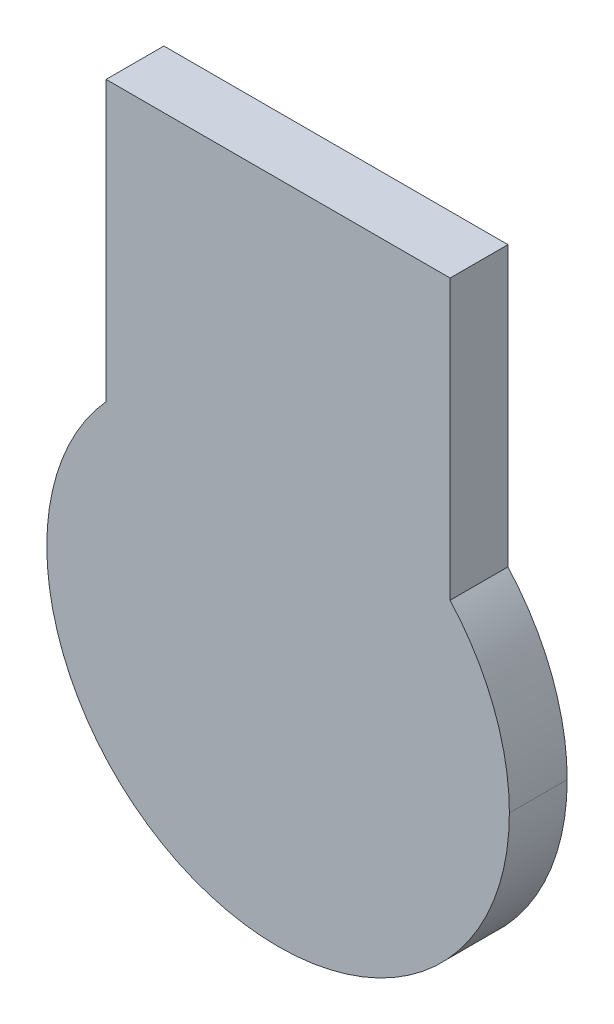
ISO-10303-21;
HEADER;
FILE_DESCRIPTION(('STEP AP214'),'2;1');
FILE_NAME('part.step','',(''),(''),'','','');
FILE_SCHEMA(('AUTOMOTIVE_DESIGN { 1 0 10303 214 1 1 1 1 }'));
ENDSEC;
DATA;
#1=APPLICATION_CONTEXT('core data for automotive mechanical design processes');
#2=APPLICATION_PROTOCOL_DEFINITION('international standard','automotive_design',2000,#1);
#3=PRODUCT_CONTEXT('',#1,'mechanical');
#4=PRODUCT('Part','Part','',(#3));
#5=PRODUCT_RELATED_PRODUCT_CATEGORY('part','',(#4));
#6=PRODUCT_DEFINITION_FORMATION('','',#4);
#7=PRODUCT_DEFINITION_CONTEXT('part definition',#1,'design');
#8=PRODUCT_DEFINITION('design','',#6,#7);
#9=PRODUCT_DEFINITION_SHAPE('','',#8);
#10=(LENGTH_UNIT() NAMED_UNIT(*) SI_UNIT(.MILLI.,.METRE.));
#11=(NAMED_UNIT(*) PLANE_ANGLE_UNIT() SI_UNIT($,.RADIAN.));
#12=(NAMED_UNIT(*) SI_UNIT($,.STERADIAN.) SOLID_ANGLE_UNIT());
#13=UNCERTAINTY_MEASURE_WITH_UNIT(LENGTH_MEASURE(1.E-05),#10,'distance_accuracy_value','');
#14=(GEOMETRIC_REPRESENTATION_CONTEXT(3) GLOBAL_UNCERTAINTY_ASSIGNED_CONTEXT((#13)) GLOBAL_UNIT_ASSIGNED_CONTEXT((#10,
#11,#12)) REPRESENTATION_CONTEXT('',''));
#15=CARTESIAN_POINT('',(0.,0.,0.));
#16=DIRECTION('',(0.,0.,1.));
#17=DIRECTION('',(1.,0.,0.));
#18=AXIS2_PLACEMENT_3D('',#15,#16,#17);
#19=CARTESIAN_POINT('',(0.,0.,0.));
#20=DIRECTION('',(0.,0.,1.));
#21=DIRECTION('',(1.,0.,0.));
#22=AXIS2_PLACEMENT_3D('',#19,#20,#21);
#23=CYLINDRICAL_SURFACE('',#22,0.8);
#24=CARTESIAN_POINT('',(0.,0.,0.));
#25=DIRECTION('',(0.,0.,1.));
#26=DIRECTION('',(1.,0.,0.));
#27=AXIS2_PLACEMENT_3D('',#24,#25,#26);
#28=CIRCLE('',#27,0.8);
#29=CARTESIAN_POINT('',(-0.595,0.534766304099277,0.));
#30=VERTEX_POINT('',#29);
#31=CARTESIAN_POINT('',(-0.8,0.,0.));
#32=VERTEX_POINT('',#31);
#33=EDGE_CURVE('E11',#30,#32,#28,.T.);
#34=ORIENTED_EDGE('',*,*,#33,.T.);
#35=DIRECTION('',(0.,0.,1.));
#36=VECTOR('',#35,1.);
#37=CARTESIAN_POINT('',(-0.8,0.,0.));
#38=LINE('',#37,#36);
#39=CARTESIAN_POINT('',(-0.8,0.,0.2));
#40=VERTEX_POINT('',#39);
#41=EDGE_CURVE('E23',#32,#40,#38,.T.);
#42=ORIENTED_EDGE('',*,*,#41,.T.);
#43=CARTESIAN_POINT('',(0.,0.,0.2));
#44=DIRECTION('',(0.,0.,1.));
#45=DIRECTION('',(1.,0.,0.));
#46=AXIS2_PLACEMENT_3D('',#43,#44,#45);
#47=CIRCLE('',#46,0.8);
#48=CARTESIAN_POINT('',(-0.595,0.534766304099277,0.2));
#49=VERTEX_POINT('',#48);
#50=EDGE_CURVE('E113',#49,#40,#47,.T.);
#51=ORIENTED_EDGE('',*,*,#50,.F.);
#52=DIRECTION('',(0.,0.,1.));
#53=VECTOR('',#52,1.);
#54=CARTESIAN_POINT('',(-0.595,0.534766304099277,0.));
#55=LINE('',#54,#53);
#56=EDGE_CURVE('E87',#30,#49,#55,.T.);
#57=ORIENTED_EDGE('',*,*,#56,.F.);
#58=EDGE_LOOP('',(#34,#42,#51,#57));
#59=FACE_BOUND('',#58,.T.);
#60=ADVANCED_FACE('F16',(#59),#23,.T.);
#61=CARTESIAN_POINT('',(0.,0.,0.));
#62=DIRECTION('',(0.,0.,1.));
#63=DIRECTION('',(1.,0.,0.));
#64=AXIS2_PLACEMENT_3D('',#61,#62,#63);
#65=CYLINDRICAL_SURFACE('',#64,0.8);
#66=ORIENTED_EDGE('',*,*,#41,.F.);
#67=CARTESIAN_POINT('',(0.,0.,0.));
#68=DIRECTION('',(0.,0.,1.));
#69=DIRECTION('',(1.,0.,0.));
#70=AXIS2_PLACEMENT_3D('',#67,#68,#69);
#71=CIRCLE('',#70,0.8);
#72=CARTESIAN_POINT('',(0.8,0.,0.));
#73=VERTEX_POINT('',#72);
#74=EDGE_CURVE('E110',#32,#73,#71,.T.);
#75=ORIENTED_EDGE('',*,*,#74,.T.);
#76=DIRECTION('',(0.,0.,1.));
#77=VECTOR('',#76,1.);
#78=CARTESIAN_POINT('',(0.8,0.,0.));
#79=LINE('',#78,#77);
#80=CARTESIAN_POINT('',(0.8,0.,0.2));
#81=VERTEX_POINT('',#80);
#82=EDGE_CURVE('E108',#73,#81,#79,.T.);
#83=ORIENTED_EDGE('',*,*,#82,.T.);
#84=CARTESIAN_POINT('',(0.,0.,0.2));
#85=DIRECTION('',(0.,0.,1.));
#86=DIRECTION('',(1.,0.,0.));
#87=AXIS2_PLACEMENT_3D('',#84,#85,#86);
#88=CIRCLE('',#87,0.8);
#89=EDGE_CURVE('E105',#40,#81,#88,.T.);
#90=ORIENTED_EDGE('',*,*,#89,.F.);
#91=EDGE_LOOP('',(#66,#75,#83,#90));
#92=FACE_BOUND('',#91,.T.);
#93=ADVANCED_FACE('F117',(#92),#65,.T.);
#94=CARTESIAN_POINT('',(0.,0.,0.));
#95=DIRECTION('',(0.,0.,1.));
#96=DIRECTION('',(1.,0.,0.));
#97=AXIS2_PLACEMENT_3D('',#94,#95,#96);
#98=PLANE('',#97);
#99=DIRECTION('',(-1.,0.,0.));
#100=VECTOR('',#99,1.);
#101=CARTESIAN_POINT('',(1.5,1.5,0.));
#102=LINE('',#101,#100);
#103=CARTESIAN_POINT('',(0.595,1.5,0.));
#104=VERTEX_POINT('',#103);
#105=CARTESIAN_POINT('',(-0.595,1.5,0.));
#106=VERTEX_POINT('',#105);
#107=EDGE_CURVE('E81',#104,#106,#102,.T.);
#108=ORIENTED_EDGE('',*,*,#107,.F.);
#109=DIRECTION('',(0.,-1.,0.));
#110=VECTOR('',#109,1.);
#111=CARTESIAN_POINT('',(0.595,-0.5,0.));
#112=LINE('',#111,#110);
#113=CARTESIAN_POINT('',(0.595,0.534766304099277,0.));
#114=VERTEX_POINT('',#113);
#115=EDGE_CURVE('E102',#104,#114,#112,.T.);
#116=ORIENTED_EDGE('',*,*,#115,.T.);
#117=CARTESIAN_POINT('',(0.,0.,0.));
#118=DIRECTION('',(0.,0.,1.));
#119=DIRECTION('',(1.,0.,0.));
#120=AXIS2_PLACEMENT_3D('',#117,#118,#119);
#121=CIRCLE('',#120,0.8);
#122=EDGE_CURVE('E99',#73,#114,#121,.T.);
#123=ORIENTED_EDGE('',*,*,#122,.F.);
#124=ORIENTED_EDGE('',*,*,#74,.F.);
#125=ORIENTED_EDGE('',*,*,#33,.F.);
#126=DIRECTION('',(0.,1.,0.));
#127=VECTOR('',#126,1.);
#128=CARTESIAN_POINT('',(-0.595000000000001,-0.5,0.));
#129=LINE('',#128,#127);
#130=EDGE_CURVE('E97',#30,#106,#129,.T.);
#131=ORIENTED_EDGE('',*,*,#130,.T.);
#132=EDGE_LOOP('',(#108,#116,#123,#124,#125,#131));
#133=FACE_BOUND('',#132,.T.);
#134=ADVANCED_FACE('F123',(#133),#98,.F.);
#135=CARTESIAN_POINT('',(0.595,-0.5,0.65));
#136=DIRECTION('',(1.,0.,0.));
#137=DIRECTION('',(0.,1.,0.));
#138=AXIS2_PLACEMENT_3D('',#135,#136,#137);
#139=PLANE('',#138);
#140=DIRECTION('',(0.,0.,-1.));
#141=VECTOR('',#140,1.);
#142=CARTESIAN_POINT('',(0.595,1.5,0.65));
#143=LINE('',#142,#141);
#144=CARTESIAN_POINT('',(0.595,1.5,0.2));
#145=VERTEX_POINT('',#144);
#146=EDGE_CURVE('E95',#145,#104,#143,.T.);
#147=ORIENTED_EDGE('',*,*,#146,.F.);
#148=DIRECTION('',(0.,-1.,0.));
#149=VECTOR('',#148,1.);
#150=CARTESIAN_POINT('',(0.595,-0.5,0.2));
#151=LINE('',#150,#149);
#152=CARTESIAN_POINT('',(0.595,0.534766304099277,0.2));
#153=VERTEX_POINT('',#152);
#154=EDGE_CURVE('E73',#145,#153,#151,.T.);
#155=ORIENTED_EDGE('',*,*,#154,.T.);
#156=DIRECTION('',(0.,0.,-1.));
#157=VECTOR('',#156,1.);
#158=CARTESIAN_POINT('',(0.595,0.534766304099277,0.));
#159=LINE('',#158,#157);
#160=EDGE_CURVE('E76',#153,#114,#159,.T.);
#161=ORIENTED_EDGE('',*,*,#160,.T.);
#162=ORIENTED_EDGE('',*,*,#115,.F.);
#163=EDGE_LOOP('',(#147,#155,#161,#162));
#164=FACE_BOUND('',#163,.T.);
#165=ADVANCED_FACE('F126',(#164),#139,.T.);
#166=CARTESIAN_POINT('',(1.5,1.5,0.2));
#167=DIRECTION('',(0.,-1.,0.));
#168=DIRECTION('',(0.,0.,-1.));
#169=AXIS2_PLACEMENT_3D('',#166,#167,#168);
#170=PLANE('',#169);
#171=DIRECTION('',(-1.,0.,0.));
#172=VECTOR('',#171,1.);
#173=CARTESIAN_POINT('',(1.5,1.5,0.2));
#174=LINE('',#173,#172);
#175=CARTESIAN_POINT('',(-0.595,1.5,0.2));
#176=VERTEX_POINT('',#175);
#177=EDGE_CURVE('E66',#145,#176,#174,.T.);
#178=ORIENTED_EDGE('',*,*,#177,.F.);
#179=ORIENTED_EDGE('',*,*,#146,.T.);
#180=ORIENTED_EDGE('',*,*,#107,.T.);
#181=DIRECTION('',(0.,0.,1.));
#182=VECTOR('',#181,1.);
#183=CARTESIAN_POINT('',(-0.595,1.5,0.65));
#184=LINE('',#183,#182);
#185=EDGE_CURVE('E77',#106,#176,#184,.T.);
#186=ORIENTED_EDGE('',*,*,#185,.T.);
#187=EDGE_LOOP('',(#178,#179,#180,#186));
#188=FACE_BOUND('',#187,.T.);
#189=ADVANCED_FACE('F80',(#188),#170,.F.);
#190=CARTESIAN_POINT('',(0.,0.,0.2));
#191=DIRECTION('',(0.,0.,1.));
#192=DIRECTION('',(1.,0.,0.));
#193=AXIS2_PLACEMENT_3D('',#190,#191,#192);
#194=PLANE('',#193);
#195=ORIENTED_EDGE('',*,*,#154,.F.);
#196=ORIENTED_EDGE('',*,*,#177,.T.);
#197=DIRECTION('',(0.,1.,0.));
#198=VECTOR('',#197,1.);
#199=CARTESIAN_POINT('',(-0.595000000000001,-0.5,0.2));
#200=LINE('',#199,#198);
#201=EDGE_CURVE('E71',#49,#176,#200,.T.);
#202=ORIENTED_EDGE('',*,*,#201,.F.);
#203=ORIENTED_EDGE('',*,*,#50,.T.);
#204=ORIENTED_EDGE('',*,*,#89,.T.);
#205=CARTESIAN_POINT('',(0.,0.,0.2));
#206=DIRECTION('',(0.,0.,1.));
#207=DIRECTION('',(1.,0.,0.));
#208=AXIS2_PLACEMENT_3D('',#205,#206,#207);
#209=CIRCLE('',#208,0.8);
#210=EDGE_CURVE('E88',#81,#153,#209,.T.);
#211=ORIENTED_EDGE('',*,*,#210,.T.);
#212=EDGE_LOOP('',(#195,#196,#202,#203,#204,#211));
#213=FACE_BOUND('',#212,.T.);
#214=ADVANCED_FACE('F68',(#213),#194,.T.);
#215=CARTESIAN_POINT('',(-0.595000000000001,-0.5,0.65));
#216=DIRECTION('',(-1.,0.,0.));
#217=DIRECTION('',(0.,-1.,0.));
#218=AXIS2_PLACEMENT_3D('',#215,#216,#217);
#219=PLANE('',#218);
#220=ORIENTED_EDGE('',*,*,#185,.F.);
#221=ORIENTED_EDGE('',*,*,#130,.F.);
#222=ORIENTED_EDGE('',*,*,#56,.T.);
#223=ORIENTED_EDGE('',*,*,#201,.T.);
#224=EDGE_LOOP('',(#220,#221,#222,#223));
#225=FACE_BOUND('',#224,.T.);
#226=ADVANCED_FACE('F86',(#225),#219,.T.);
#227=CARTESIAN_POINT('',(0.,0.,0.));
#228=DIRECTION('',(0.,0.,1.));
#229=DIRECTION('',(1.,0.,0.));
#230=AXIS2_PLACEMENT_3D('',#227,#228,#229);
#231=CYLINDRICAL_SURFACE('',#230,0.8);
#232=ORIENTED_EDGE('',*,*,#82,.F.);
#233=ORIENTED_EDGE('',*,*,#122,.T.);
#234=ORIENTED_EDGE('',*,*,#160,.F.);
#235=ORIENTED_EDGE('',*,*,#210,.F.);
#236=EDGE_LOOP('',(#232,#233,#234,#235));
#237=FACE_BOUND('',#236,.T.);
#238=ADVANCED_FACE('F121',(#237),#231,.T.);
#239=CLOSED_SHELL('',(#60,#93,#134,#165,#189,#214,#226,#238));
#240=MANIFOLD_SOLID_BREP('B1',#239);
#241=ADVANCED_BREP_SHAPE_REPRESENTATION('',(#18,#240),#14);
#242=SHAPE_DEFINITION_REPRESENTATION(#9,#241);
ENDSEC;
END-ISO-10303-21;
